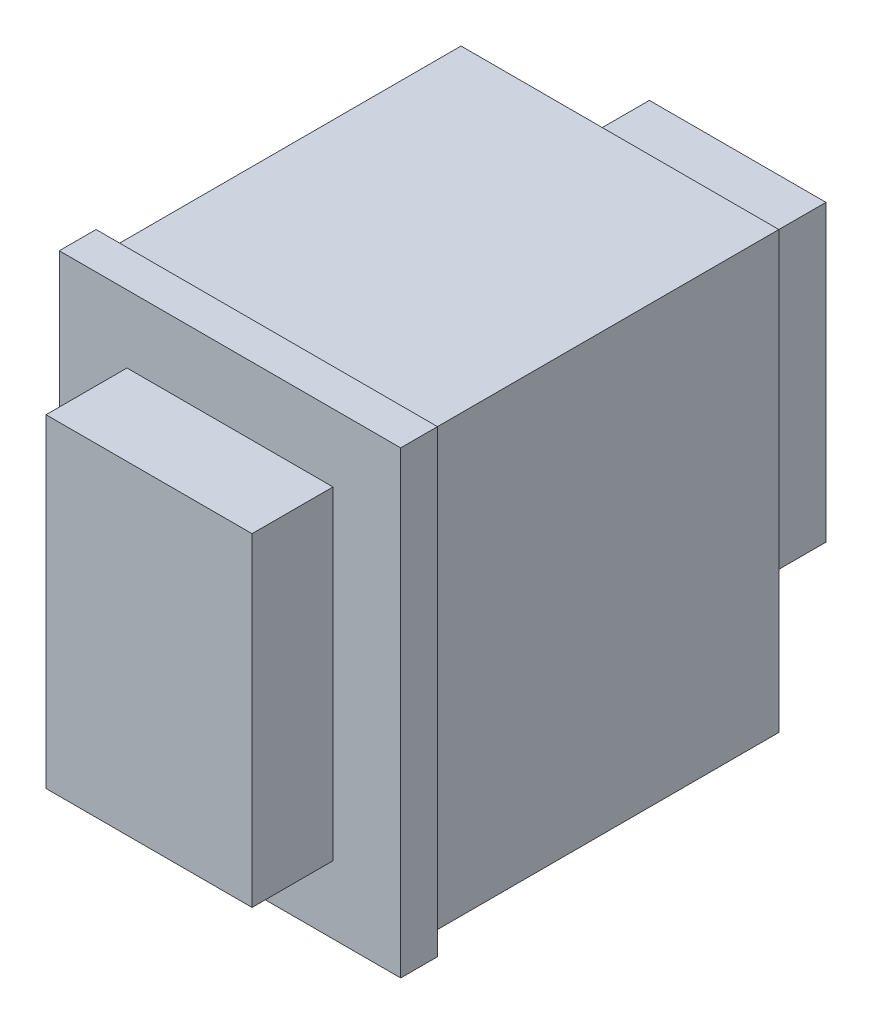
ISO-10303-21;
HEADER;
FILE_DESCRIPTION(('STEP AP214'),'2;1');
FILE_NAME('part.step','',(''),(''),'','','');
FILE_SCHEMA(('AUTOMOTIVE_DESIGN { 1 0 10303 214 1 1 1 1 }'));
ENDSEC;
DATA;
#1=APPLICATION_CONTEXT('core data for automotive mechanical design processes');
#2=APPLICATION_PROTOCOL_DEFINITION('international standard','automotive_design',2000,#1);
#3=PRODUCT_CONTEXT('',#1,'mechanical');
#4=PRODUCT('Part','Part','',(#3));
#5=PRODUCT_RELATED_PRODUCT_CATEGORY('part','',(#4));
#6=PRODUCT_DEFINITION_FORMATION('','',#4);
#7=PRODUCT_DEFINITION_CONTEXT('part definition',#1,'design');
#8=PRODUCT_DEFINITION('design','',#6,#7);
#9=PRODUCT_DEFINITION_SHAPE('','',#8);
#10=(LENGTH_UNIT() NAMED_UNIT(*) SI_UNIT(.MILLI.,.METRE.));
#11=(NAMED_UNIT(*) PLANE_ANGLE_UNIT() SI_UNIT($,.RADIAN.));
#12=(NAMED_UNIT(*) SI_UNIT($,.STERADIAN.) SOLID_ANGLE_UNIT());
#13=UNCERTAINTY_MEASURE_WITH_UNIT(LENGTH_MEASURE(1.E-05),#10,'distance_accuracy_value','');
#14=(GEOMETRIC_REPRESENTATION_CONTEXT(3) GLOBAL_UNCERTAINTY_ASSIGNED_CONTEXT((#13)) GLOBAL_UNIT_ASSIGNED_CONTEXT((#10,
#11,#12)) REPRESENTATION_CONTEXT('',''));
#15=CARTESIAN_POINT('',(0.,0.,0.));
#16=DIRECTION('',(0.,0.,1.));
#17=DIRECTION('',(1.,0.,0.));
#18=AXIS2_PLACEMENT_3D('',#15,#16,#17);
#19=CARTESIAN_POINT('',(-11.6,15.6,2.5));
#20=DIRECTION('',(1.,0.,0.));
#21=DIRECTION('',(0.,0.,-1.));
#22=AXIS2_PLACEMENT_3D('',#19,#20,#21);
#23=PLANE('',#22);
#24=DIRECTION('',(0.,-1.,0.));
#25=VECTOR('',#24,1.);
#26=CARTESIAN_POINT('',(-11.6,15.6,0.));
#27=LINE('',#26,#25);
#28=CARTESIAN_POINT('',(-11.6,15.6,0.));
#29=VERTEX_POINT('',#28);
#30=CARTESIAN_POINT('',(-11.6,-15.6,0.));
#31=VERTEX_POINT('',#30);
#32=EDGE_CURVE('E254',#29,#31,#27,.T.);
#33=ORIENTED_EDGE('',*,*,#32,.T.);
#34=DIRECTION('',(0.,0.,-1.));
#35=VECTOR('',#34,1.);
#36=CARTESIAN_POINT('',(-11.6,-15.6,2.5));
#37=LINE('',#36,#35);
#38=CARTESIAN_POINT('',(-11.6,-15.6,2.5));
#39=VERTEX_POINT('',#38);
#40=EDGE_CURVE('E11',#39,#31,#37,.T.);
#41=ORIENTED_EDGE('',*,*,#40,.F.);
#42=DIRECTION('',(0.,-1.,0.));
#43=VECTOR('',#42,1.);
#44=CARTESIAN_POINT('',(-11.6,15.6,2.5));
#45=LINE('',#44,#43);
#46=CARTESIAN_POINT('',(-11.6,15.6,2.5));
#47=VERTEX_POINT('',#46);
#48=EDGE_CURVE('E258',#47,#39,#45,.T.);
#49=ORIENTED_EDGE('',*,*,#48,.F.);
#50=DIRECTION('',(0.,0.,-1.));
#51=VECTOR('',#50,1.);
#52=CARTESIAN_POINT('',(-11.6,15.6,2.5));
#53=LINE('',#52,#51);
#54=EDGE_CURVE('E266',#47,#29,#53,.T.);
#55=ORIENTED_EDGE('',*,*,#54,.T.);
#56=EDGE_LOOP('',(#33,#41,#49,#55));
#57=FACE_BOUND('',#56,.T.);
#58=ADVANCED_FACE('F39',(#57),#23,.F.);
#59=CARTESIAN_POINT('',(-11.6,-15.6,2.5));
#60=DIRECTION('',(0.,1.,0.));
#61=DIRECTION('',(0.,0.,1.));
#62=AXIS2_PLACEMENT_3D('',#59,#60,#61);
#63=PLANE('',#62);
#64=DIRECTION('',(1.,0.,0.));
#65=VECTOR('',#64,1.);
#66=CARTESIAN_POINT('',(-11.6,-15.6,0.));
#67=LINE('',#66,#65);
#68=CARTESIAN_POINT('',(11.6,-15.6,0.));
#69=VERTEX_POINT('',#68);
#70=EDGE_CURVE('E267',#31,#69,#67,.T.);
#71=ORIENTED_EDGE('',*,*,#70,.T.);
#72=DIRECTION('',(0.,0.,-1.));
#73=VECTOR('',#72,1.);
#74=CARTESIAN_POINT('',(11.6,-15.6,2.5));
#75=LINE('',#74,#73);
#76=CARTESIAN_POINT('',(11.6,-15.6,2.5));
#77=VERTEX_POINT('',#76);
#78=EDGE_CURVE('E46',#77,#69,#75,.T.);
#79=ORIENTED_EDGE('',*,*,#78,.F.);
#80=DIRECTION('',(1.,0.,0.));
#81=VECTOR('',#80,1.);
#82=CARTESIAN_POINT('',(-11.6,-15.6,2.5));
#83=LINE('',#82,#81);
#84=EDGE_CURVE('E259',#39,#77,#83,.T.);
#85=ORIENTED_EDGE('',*,*,#84,.F.);
#86=ORIENTED_EDGE('',*,*,#40,.T.);
#87=EDGE_LOOP('',(#71,#79,#85,#86));
#88=FACE_BOUND('',#87,.T.);
#89=ADVANCED_FACE('F298',(#88),#63,.F.);
#90=CARTESIAN_POINT('',(11.6,-15.6,2.5));
#91=DIRECTION('',(-1.,0.,0.));
#92=DIRECTION('',(0.,0.,1.));
#93=AXIS2_PLACEMENT_3D('',#90,#91,#92);
#94=PLANE('',#93);
#95=DIRECTION('',(0.,1.,0.));
#96=VECTOR('',#95,1.);
#97=CARTESIAN_POINT('',(11.6,-15.6,0.));
#98=LINE('',#97,#96);
#99=CARTESIAN_POINT('',(11.6,15.6,0.));
#100=VERTEX_POINT('',#99);
#101=EDGE_CURVE('E271',#69,#100,#98,.T.);
#102=ORIENTED_EDGE('',*,*,#101,.T.);
#103=DIRECTION('',(0.,0.,-1.));
#104=VECTOR('',#103,1.);
#105=CARTESIAN_POINT('',(11.6,15.6,2.5));
#106=LINE('',#105,#104);
#107=CARTESIAN_POINT('',(11.6,15.6,2.5));
#108=VERTEX_POINT('',#107);
#109=EDGE_CURVE('E277',#108,#100,#106,.T.);
#110=ORIENTED_EDGE('',*,*,#109,.F.);
#111=DIRECTION('',(0.,1.,0.));
#112=VECTOR('',#111,1.);
#113=CARTESIAN_POINT('',(11.6,-15.6,2.5));
#114=LINE('',#113,#112);
#115=EDGE_CURVE('E265',#77,#108,#114,.T.);
#116=ORIENTED_EDGE('',*,*,#115,.F.);
#117=ORIENTED_EDGE('',*,*,#78,.T.);
#118=EDGE_LOOP('',(#102,#110,#116,#117));
#119=FACE_BOUND('',#118,.T.);
#120=ADVANCED_FACE('F285',(#119),#94,.F.);
#121=CARTESIAN_POINT('',(11.6,15.6,2.5));
#122=DIRECTION('',(0.,-1.,0.));
#123=DIRECTION('',(0.,0.,-1.));
#124=AXIS2_PLACEMENT_3D('',#121,#122,#123);
#125=PLANE('',#124);
#126=DIRECTION('',(-1.,0.,0.));
#127=VECTOR('',#126,1.);
#128=CARTESIAN_POINT('',(11.6,15.6,0.));
#129=LINE('',#128,#127);
#130=EDGE_CURVE('E257',#100,#29,#129,.T.);
#131=ORIENTED_EDGE('',*,*,#130,.T.);
#132=ORIENTED_EDGE('',*,*,#54,.F.);
#133=DIRECTION('',(-1.,0.,0.));
#134=VECTOR('',#133,1.);
#135=CARTESIAN_POINT('',(11.6,15.6,2.5));
#136=LINE('',#135,#134);
#137=EDGE_CURVE('E262',#108,#47,#136,.T.);
#138=ORIENTED_EDGE('',*,*,#137,.F.);
#139=ORIENTED_EDGE('',*,*,#109,.T.);
#140=EDGE_LOOP('',(#131,#132,#138,#139));
#141=FACE_BOUND('',#140,.T.);
#142=ADVANCED_FACE('F295',(#141),#125,.F.);
#143=CARTESIAN_POINT('',(0.,0.,2.5));
#144=DIRECTION('',(0.,0.,1.));
#145=DIRECTION('',(1.,0.,0.));
#146=AXIS2_PLACEMENT_3D('',#143,#144,#145);
#147=PLANE('',#146);
#148=DIRECTION('',(0.,-1.,0.));
#149=VECTOR('',#148,1.);
#150=CARTESIAN_POINT('',(-7.,11.,2.5));
#151=LINE('',#150,#149);
#152=CARTESIAN_POINT('',(-7.,11.,2.5));
#153=VERTEX_POINT('',#152);
#154=CARTESIAN_POINT('',(-7.,-11.,2.5));
#155=VERTEX_POINT('',#154);
#156=EDGE_CURVE('E225',#153,#155,#151,.T.);
#157=ORIENTED_EDGE('',*,*,#156,.F.);
#158=DIRECTION('',(-1.,0.,0.));
#159=VECTOR('',#158,1.);
#160=CARTESIAN_POINT('',(7.,11.,2.5));
#161=LINE('',#160,#159);
#162=CARTESIAN_POINT('',(7.,11.,2.5));
#163=VERTEX_POINT('',#162);
#164=EDGE_CURVE('E226',#163,#153,#161,.T.);
#165=ORIENTED_EDGE('',*,*,#164,.F.);
#166=DIRECTION('',(0.,1.,0.));
#167=VECTOR('',#166,1.);
#168=CARTESIAN_POINT('',(7.,-11.,2.5));
#169=LINE('',#168,#167);
#170=CARTESIAN_POINT('',(7.,-11.,2.5));
#171=VERTEX_POINT('',#170);
#172=EDGE_CURVE('E239',#171,#163,#169,.T.);
#173=ORIENTED_EDGE('',*,*,#172,.F.);
#174=DIRECTION('',(1.,0.,0.));
#175=VECTOR('',#174,1.);
#176=CARTESIAN_POINT('',(-7.,-11.,2.5));
#177=LINE('',#176,#175);
#178=EDGE_CURVE('E237',#155,#171,#177,.T.);
#179=ORIENTED_EDGE('',*,*,#178,.F.);
#180=EDGE_LOOP('',(#157,#165,#173,#179));
#181=FACE_BOUND('',#180,.T.);
#182=ORIENTED_EDGE('',*,*,#48,.T.);
#183=ORIENTED_EDGE('',*,*,#84,.T.);
#184=ORIENTED_EDGE('',*,*,#115,.T.);
#185=ORIENTED_EDGE('',*,*,#137,.T.);
#186=EDGE_LOOP('',(#182,#183,#184,#185));
#187=FACE_BOUND('',#186,.T.);
#188=ADVANCED_FACE('F300',(#181,#187),#147,.T.);
#189=CARTESIAN_POINT('',(0.,0.,0.));
#190=DIRECTION('',(0.,0.,1.));
#191=DIRECTION('',(1.,0.,0.));
#192=AXIS2_PLACEMENT_3D('',#189,#190,#191);
#193=PLANE('',#192);
#194=DIRECTION('',(-1.,0.,0.));
#195=VECTOR('',#194,1.);
#196=CARTESIAN_POINT('',(10.8,14.8,0.));
#197=LINE('',#196,#195);
#198=CARTESIAN_POINT('',(10.8,14.8,0.));
#199=VERTEX_POINT('',#198);
#200=CARTESIAN_POINT('',(-10.8,14.8,0.));
#201=VERTEX_POINT('',#200);
#202=EDGE_CURVE('E203',#199,#201,#197,.T.);
#203=ORIENTED_EDGE('',*,*,#202,.T.);
#204=DIRECTION('',(0.,-1.,0.));
#205=VECTOR('',#204,1.);
#206=CARTESIAN_POINT('',(-10.8,14.8,0.));
#207=LINE('',#206,#205);
#208=CARTESIAN_POINT('',(-10.8,-14.8,0.));
#209=VERTEX_POINT('',#208);
#210=EDGE_CURVE('E64',#201,#209,#207,.T.);
#211=ORIENTED_EDGE('',*,*,#210,.T.);
#212=DIRECTION('',(1.,0.,0.));
#213=VECTOR('',#212,1.);
#214=CARTESIAN_POINT('',(-10.8,-14.8,0.));
#215=LINE('',#214,#213);
#216=CARTESIAN_POINT('',(10.8,-14.8,0.));
#217=VERTEX_POINT('',#216);
#218=EDGE_CURVE('E193',#209,#217,#215,.T.);
#219=ORIENTED_EDGE('',*,*,#218,.T.);
#220=DIRECTION('',(0.,1.,0.));
#221=VECTOR('',#220,1.);
#222=CARTESIAN_POINT('',(10.8,-14.8,0.));
#223=LINE('',#222,#221);
#224=EDGE_CURVE('E196',#217,#199,#223,.T.);
#225=ORIENTED_EDGE('',*,*,#224,.T.);
#226=EDGE_LOOP('',(#203,#211,#219,#225));
#227=FACE_BOUND('',#226,.T.);
#228=ORIENTED_EDGE('',*,*,#32,.F.);
#229=ORIENTED_EDGE('',*,*,#130,.F.);
#230=ORIENTED_EDGE('',*,*,#101,.F.);
#231=ORIENTED_EDGE('',*,*,#70,.F.);
#232=EDGE_LOOP('',(#228,#229,#230,#231));
#233=FACE_BOUND('',#232,.T.);
#234=ADVANCED_FACE('F288',(#227,#233),#193,.F.);
#235=CARTESIAN_POINT('',(-7.,11.,8.));
#236=DIRECTION('',(1.,0.,0.));
#237=DIRECTION('',(0.,0.,-1.));
#238=AXIS2_PLACEMENT_3D('',#235,#236,#237);
#239=PLANE('',#238);
#240=ORIENTED_EDGE('',*,*,#156,.T.);
#241=DIRECTION('',(0.,0.,-1.));
#242=VECTOR('',#241,1.);
#243=CARTESIAN_POINT('',(-7.,-11.,8.));
#244=LINE('',#243,#242);
#245=CARTESIAN_POINT('',(-7.,-11.,8.));
#246=VERTEX_POINT('',#245);
#247=EDGE_CURVE('E252',#246,#155,#244,.T.);
#248=ORIENTED_EDGE('',*,*,#247,.F.);
#249=DIRECTION('',(0.,-1.,0.));
#250=VECTOR('',#249,1.);
#251=CARTESIAN_POINT('',(-7.,11.,8.));
#252=LINE('',#251,#250);
#253=CARTESIAN_POINT('',(-7.,11.,8.));
#254=VERTEX_POINT('',#253);
#255=EDGE_CURVE('E224',#254,#246,#252,.T.);
#256=ORIENTED_EDGE('',*,*,#255,.F.);
#257=DIRECTION('',(0.,0.,-1.));
#258=VECTOR('',#257,1.);
#259=CARTESIAN_POINT('',(-7.,11.,8.));
#260=LINE('',#259,#258);
#261=EDGE_CURVE('E234',#254,#153,#260,.T.);
#262=ORIENTED_EDGE('',*,*,#261,.T.);
#263=EDGE_LOOP('',(#240,#248,#256,#262));
#264=FACE_BOUND('',#263,.T.);
#265=ADVANCED_FACE('F313',(#264),#239,.F.);
#266=CARTESIAN_POINT('',(-7.,-11.,8.));
#267=DIRECTION('',(0.,1.,0.));
#268=DIRECTION('',(0.,0.,1.));
#269=AXIS2_PLACEMENT_3D('',#266,#267,#268);
#270=PLANE('',#269);
#271=ORIENTED_EDGE('',*,*,#178,.T.);
#272=DIRECTION('',(0.,0.,-1.));
#273=VECTOR('',#272,1.);
#274=CARTESIAN_POINT('',(7.,-11.,8.));
#275=LINE('',#274,#273);
#276=CARTESIAN_POINT('',(7.,-11.,8.));
#277=VERTEX_POINT('',#276);
#278=EDGE_CURVE('E248',#277,#171,#275,.T.);
#279=ORIENTED_EDGE('',*,*,#278,.F.);
#280=DIRECTION('',(1.,0.,0.));
#281=VECTOR('',#280,1.);
#282=CARTESIAN_POINT('',(-7.,-11.,8.));
#283=LINE('',#282,#281);
#284=EDGE_CURVE('E229',#246,#277,#283,.T.);
#285=ORIENTED_EDGE('',*,*,#284,.F.);
#286=ORIENTED_EDGE('',*,*,#247,.T.);
#287=EDGE_LOOP('',(#271,#279,#285,#286));
#288=FACE_BOUND('',#287,.T.);
#289=ADVANCED_FACE('F318',(#288),#270,.F.);
#290=CARTESIAN_POINT('',(7.,-11.,8.));
#291=DIRECTION('',(-1.,0.,0.));
#292=DIRECTION('',(0.,0.,1.));
#293=AXIS2_PLACEMENT_3D('',#290,#291,#292);
#294=PLANE('',#293);
#295=ORIENTED_EDGE('',*,*,#172,.T.);
#296=DIRECTION('',(0.,0.,-1.));
#297=VECTOR('',#296,1.);
#298=CARTESIAN_POINT('',(7.,11.,8.));
#299=LINE('',#298,#297);
#300=CARTESIAN_POINT('',(7.,11.,8.));
#301=VERTEX_POINT('',#300);
#302=EDGE_CURVE('E246',#301,#163,#299,.T.);
#303=ORIENTED_EDGE('',*,*,#302,.F.);
#304=DIRECTION('',(0.,1.,0.));
#305=VECTOR('',#304,1.);
#306=CARTESIAN_POINT('',(7.,-11.,8.));
#307=LINE('',#306,#305);
#308=EDGE_CURVE('E228',#277,#301,#307,.T.);
#309=ORIENTED_EDGE('',*,*,#308,.F.);
#310=ORIENTED_EDGE('',*,*,#278,.T.);
#311=EDGE_LOOP('',(#295,#303,#309,#310));
#312=FACE_BOUND('',#311,.T.);
#313=ADVANCED_FACE('F325',(#312),#294,.F.);
#314=CARTESIAN_POINT('',(7.,11.,8.));
#315=DIRECTION('',(0.,-1.,0.));
#316=DIRECTION('',(0.,0.,-1.));
#317=AXIS2_PLACEMENT_3D('',#314,#315,#316);
#318=PLANE('',#317);
#319=ORIENTED_EDGE('',*,*,#164,.T.);
#320=ORIENTED_EDGE('',*,*,#261,.F.);
#321=DIRECTION('',(-1.,0.,0.));
#322=VECTOR('',#321,1.);
#323=CARTESIAN_POINT('',(7.,11.,8.));
#324=LINE('',#323,#322);
#325=EDGE_CURVE('E231',#301,#254,#324,.T.);
#326=ORIENTED_EDGE('',*,*,#325,.F.);
#327=ORIENTED_EDGE('',*,*,#302,.T.);
#328=EDGE_LOOP('',(#319,#320,#326,#327));
#329=FACE_BOUND('',#328,.T.);
#330=ADVANCED_FACE('F326',(#329),#318,.F.);
#331=CARTESIAN_POINT('',(0.,0.,8.));
#332=DIRECTION('',(0.,0.,1.));
#333=DIRECTION('',(1.,0.,0.));
#334=AXIS2_PLACEMENT_3D('',#331,#332,#333);
#335=PLANE('',#334);
#336=ORIENTED_EDGE('',*,*,#255,.T.);
#337=ORIENTED_EDGE('',*,*,#284,.T.);
#338=ORIENTED_EDGE('',*,*,#308,.T.);
#339=ORIENTED_EDGE('',*,*,#325,.T.);
#340=EDGE_LOOP('',(#336,#337,#338,#339));
#341=FACE_BOUND('',#340,.T.);
#342=ADVANCED_FACE('F329',(#341),#335,.T.);
#343=CARTESIAN_POINT('',(-10.8,14.8,0.));
#344=DIRECTION('',(1.,0.,0.));
#345=DIRECTION('',(0.,0.,-1.));
#346=AXIS2_PLACEMENT_3D('',#343,#344,#345);
#347=PLANE('',#346);
#348=DIRECTION('',(0.,-1.,0.));
#349=VECTOR('',#348,1.);
#350=CARTESIAN_POINT('',(-10.8,14.8,-24.));
#351=LINE('',#350,#349);
#352=CARTESIAN_POINT('',(-10.8,14.8,-24.));
#353=VERTEX_POINT('',#352);
#354=CARTESIAN_POINT('',(-10.8,-14.8,-24.));
#355=VERTEX_POINT('',#354);
#356=EDGE_CURVE('E166',#353,#355,#351,.T.);
#357=ORIENTED_EDGE('',*,*,#356,.T.);
#358=DIRECTION('',(0.,0.,-1.));
#359=VECTOR('',#358,1.);
#360=CARTESIAN_POINT('',(-10.8,-14.8,0.));
#361=LINE('',#360,#359);
#362=EDGE_CURVE('E218',#209,#355,#361,.T.);
#363=ORIENTED_EDGE('',*,*,#362,.F.);
#364=ORIENTED_EDGE('',*,*,#210,.F.);
#365=DIRECTION('',(0.,0.,-1.));
#366=VECTOR('',#365,1.);
#367=CARTESIAN_POINT('',(-10.8,14.8,0.));
#368=LINE('',#367,#366);
#369=EDGE_CURVE('E204',#201,#353,#368,.T.);
#370=ORIENTED_EDGE('',*,*,#369,.T.);
#371=EDGE_LOOP('',(#357,#363,#364,#370));
#372=FACE_BOUND('',#371,.T.);
#373=ADVANCED_FACE('F331',(#372),#347,.F.);
#374=CARTESIAN_POINT('',(-10.8,-14.8,0.));
#375=DIRECTION('',(0.,1.,0.));
#376=DIRECTION('',(0.,0.,1.));
#377=AXIS2_PLACEMENT_3D('',#374,#375,#376);
#378=PLANE('',#377);
#379=DIRECTION('',(1.,0.,0.));
#380=VECTOR('',#379,1.);
#381=CARTESIAN_POINT('',(-10.8,-14.8,-24.));
#382=LINE('',#381,#380);
#383=CARTESIAN_POINT('',(10.8,-14.8,-24.));
#384=VERTEX_POINT('',#383);
#385=EDGE_CURVE('E210',#355,#384,#382,.T.);
#386=ORIENTED_EDGE('',*,*,#385,.T.);
#387=DIRECTION('',(0.,0.,-1.));
#388=VECTOR('',#387,1.);
#389=CARTESIAN_POINT('',(10.8,-14.8,0.));
#390=LINE('',#389,#388);
#391=EDGE_CURVE('E216',#217,#384,#390,.T.);
#392=ORIENTED_EDGE('',*,*,#391,.F.);
#393=ORIENTED_EDGE('',*,*,#218,.F.);
#394=ORIENTED_EDGE('',*,*,#362,.T.);
#395=EDGE_LOOP('',(#386,#392,#393,#394));
#396=FACE_BOUND('',#395,.T.);
#397=ADVANCED_FACE('F340',(#396),#378,.F.);
#398=CARTESIAN_POINT('',(10.8,-14.8,0.));
#399=DIRECTION('',(-1.,0.,0.));
#400=DIRECTION('',(0.,0.,1.));
#401=AXIS2_PLACEMENT_3D('',#398,#399,#400);
#402=PLANE('',#401);
#403=DIRECTION('',(0.,1.,0.));
#404=VECTOR('',#403,1.);
#405=CARTESIAN_POINT('',(10.8,-14.8,-24.));
#406=LINE('',#405,#404);
#407=CARTESIAN_POINT('',(10.8,14.8,-24.));
#408=VERTEX_POINT('',#407);
#409=EDGE_CURVE('E207',#384,#408,#406,.T.);
#410=ORIENTED_EDGE('',*,*,#409,.T.);
#411=DIRECTION('',(0.,0.,-1.));
#412=VECTOR('',#411,1.);
#413=CARTESIAN_POINT('',(10.8,14.8,0.));
#414=LINE('',#413,#412);
#415=EDGE_CURVE('E213',#199,#408,#414,.T.);
#416=ORIENTED_EDGE('',*,*,#415,.F.);
#417=ORIENTED_EDGE('',*,*,#224,.F.);
#418=ORIENTED_EDGE('',*,*,#391,.T.);
#419=EDGE_LOOP('',(#410,#416,#417,#418));
#420=FACE_BOUND('',#419,.T.);
#421=ADVANCED_FACE('F341',(#420),#402,.F.);
#422=CARTESIAN_POINT('',(10.8,14.8,0.));
#423=DIRECTION('',(0.,-1.,0.));
#424=DIRECTION('',(0.,0.,-1.));
#425=AXIS2_PLACEMENT_3D('',#422,#423,#424);
#426=PLANE('',#425);
#427=DIRECTION('',(-1.,0.,0.));
#428=VECTOR('',#427,1.);
#429=CARTESIAN_POINT('',(10.8,14.8,-24.));
#430=LINE('',#429,#428);
#431=EDGE_CURVE('E195',#408,#353,#430,.T.);
#432=ORIENTED_EDGE('',*,*,#431,.T.);
#433=ORIENTED_EDGE('',*,*,#369,.F.);
#434=ORIENTED_EDGE('',*,*,#202,.F.);
#435=ORIENTED_EDGE('',*,*,#415,.T.);
#436=EDGE_LOOP('',(#432,#433,#434,#435));
#437=FACE_BOUND('',#436,.T.);
#438=ADVANCED_FACE('F345',(#437),#426,.F.);
#439=CARTESIAN_POINT('',(0.,0.,-24.));
#440=DIRECTION('',(0.,0.,1.));
#441=DIRECTION('',(1.,0.,0.));
#442=AXIS2_PLACEMENT_3D('',#439,#440,#441);
#443=PLANE('',#442);
#444=DIRECTION('',(-1.,0.,0.));
#445=VECTOR('',#444,1.);
#446=CARTESIAN_POINT('',(6.,10.,-24.));
#447=LINE('',#446,#445);
#448=CARTESIAN_POINT('',(6.,10.,-24.));
#449=VERTEX_POINT('',#448);
#450=CARTESIAN_POINT('',(-6.,10.,-24.));
#451=VERTEX_POINT('',#450);
#452=EDGE_CURVE('E172',#449,#451,#447,.T.);
#453=ORIENTED_EDGE('',*,*,#452,.T.);
#454=DIRECTION('',(0.,-1.,0.));
#455=VECTOR('',#454,1.);
#456=CARTESIAN_POINT('',(-6.,10.,-24.));
#457=LINE('',#456,#455);
#458=CARTESIAN_POINT('',(-6.,-10.,-24.));
#459=VERTEX_POINT('',#458);
#460=EDGE_CURVE('E52',#451,#459,#457,.T.);
#461=ORIENTED_EDGE('',*,*,#460,.T.);
#462=DIRECTION('',(1.,0.,0.));
#463=VECTOR('',#462,1.);
#464=CARTESIAN_POINT('',(-6.,-10.,-24.));
#465=LINE('',#464,#463);
#466=CARTESIAN_POINT('',(6.,-10.,-24.));
#467=VERTEX_POINT('',#466);
#468=EDGE_CURVE('E154',#459,#467,#465,.T.);
#469=ORIENTED_EDGE('',*,*,#468,.T.);
#470=DIRECTION('',(0.,1.,0.));
#471=VECTOR('',#470,1.);
#472=CARTESIAN_POINT('',(6.,-10.,-24.));
#473=LINE('',#472,#471);
#474=EDGE_CURVE('E163',#467,#449,#473,.T.);
#475=ORIENTED_EDGE('',*,*,#474,.T.);
#476=EDGE_LOOP('',(#453,#461,#469,#475));
#477=FACE_BOUND('',#476,.T.);
#478=ORIENTED_EDGE('',*,*,#356,.F.);
#479=ORIENTED_EDGE('',*,*,#431,.F.);
#480=ORIENTED_EDGE('',*,*,#409,.F.);
#481=ORIENTED_EDGE('',*,*,#385,.F.);
#482=EDGE_LOOP('',(#478,#479,#480,#481));
#483=FACE_BOUND('',#482,.T.);
#484=ADVANCED_FACE('F171',(#477,#483),#443,.F.);
#485=CARTESIAN_POINT('',(-6.,10.,-24.));
#486=DIRECTION('',(1.,0.,0.));
#487=DIRECTION('',(0.,0.,-1.));
#488=AXIS2_PLACEMENT_3D('',#485,#486,#487);
#489=PLANE('',#488);
#490=DIRECTION('',(0.,-1.,0.));
#491=VECTOR('',#490,1.);
#492=CARTESIAN_POINT('',(-6.,10.,-32.));
#493=LINE('',#492,#491);
#494=CARTESIAN_POINT('',(-6.,10.,-32.));
#495=VERTEX_POINT('',#494);
#496=CARTESIAN_POINT('',(-6.,-10.,-32.));
#497=VERTEX_POINT('',#496);
#498=EDGE_CURVE('E169',#495,#497,#493,.T.);
#499=ORIENTED_EDGE('',*,*,#498,.T.);
#500=DIRECTION('',(0.,0.,-1.));
#501=VECTOR('',#500,1.);
#502=CARTESIAN_POINT('',(-6.,-10.,-24.));
#503=LINE('',#502,#501);
#504=EDGE_CURVE('E160',#459,#497,#503,.T.);
#505=ORIENTED_EDGE('',*,*,#504,.F.);
#506=ORIENTED_EDGE('',*,*,#460,.F.);
#507=DIRECTION('',(0.,0.,-1.));
#508=VECTOR('',#507,1.);
#509=CARTESIAN_POINT('',(-6.,10.,-24.));
#510=LINE('',#509,#508);
#511=EDGE_CURVE('E181',#451,#495,#510,.T.);
#512=ORIENTED_EDGE('',*,*,#511,.T.);
#513=EDGE_LOOP('',(#499,#505,#506,#512));
#514=FACE_BOUND('',#513,.T.);
#515=ADVANCED_FACE('F167',(#514),#489,.F.);
#516=CARTESIAN_POINT('',(-6.,-10.,-24.));
#517=DIRECTION('',(0.,1.,0.));
#518=DIRECTION('',(0.,0.,1.));
#519=AXIS2_PLACEMENT_3D('',#516,#517,#518);
#520=PLANE('',#519);
#521=DIRECTION('',(1.,0.,0.));
#522=VECTOR('',#521,1.);
#523=CARTESIAN_POINT('',(-6.,-10.,-32.));
#524=LINE('',#523,#522);
#525=CARTESIAN_POINT('',(6.,-10.,-32.));
#526=VERTEX_POINT('',#525);
#527=EDGE_CURVE('E183',#497,#526,#524,.T.);
#528=ORIENTED_EDGE('',*,*,#527,.T.);
#529=DIRECTION('',(0.,0.,-1.));
#530=VECTOR('',#529,1.);
#531=CARTESIAN_POINT('',(6.,-10.,-24.));
#532=LINE('',#531,#530);
#533=EDGE_CURVE('E159',#467,#526,#532,.T.);
#534=ORIENTED_EDGE('',*,*,#533,.F.);
#535=ORIENTED_EDGE('',*,*,#468,.F.);
#536=ORIENTED_EDGE('',*,*,#504,.T.);
#537=EDGE_LOOP('',(#528,#534,#535,#536));
#538=FACE_BOUND('',#537,.T.);
#539=ADVANCED_FACE('F156',(#538),#520,.F.);
#540=CARTESIAN_POINT('',(6.,-10.,-24.));
#541=DIRECTION('',(-1.,0.,0.));
#542=DIRECTION('',(0.,0.,1.));
#543=AXIS2_PLACEMENT_3D('',#540,#541,#542);
#544=PLANE('',#543);
#545=DIRECTION('',(0.,1.,0.));
#546=VECTOR('',#545,1.);
#547=CARTESIAN_POINT('',(6.,-10.,-32.));
#548=LINE('',#547,#546);
#549=CARTESIAN_POINT('',(6.,10.,-32.));
#550=VERTEX_POINT('',#549);
#551=EDGE_CURVE('E179',#526,#550,#548,.T.);
#552=ORIENTED_EDGE('',*,*,#551,.T.);
#553=DIRECTION('',(0.,0.,-1.));
#554=VECTOR('',#553,1.);
#555=CARTESIAN_POINT('',(6.,10.,-24.));
#556=LINE('',#555,#554);
#557=EDGE_CURVE('E188',#449,#550,#556,.T.);
#558=ORIENTED_EDGE('',*,*,#557,.F.);
#559=ORIENTED_EDGE('',*,*,#474,.F.);
#560=ORIENTED_EDGE('',*,*,#533,.T.);
#561=EDGE_LOOP('',(#552,#558,#559,#560));
#562=FACE_BOUND('',#561,.T.);
#563=ADVANCED_FACE('F356',(#562),#544,.F.);
#564=CARTESIAN_POINT('',(6.,10.,-24.));
#565=DIRECTION('',(0.,-1.,0.));
#566=DIRECTION('',(0.,0.,-1.));
#567=AXIS2_PLACEMENT_3D('',#564,#565,#566);
#568=PLANE('',#567);
#569=DIRECTION('',(-1.,0.,0.));
#570=VECTOR('',#569,1.);
#571=CARTESIAN_POINT('',(6.,10.,-32.));
#572=LINE('',#571,#570);
#573=EDGE_CURVE('E176',#550,#495,#572,.T.);
#574=ORIENTED_EDGE('',*,*,#573,.T.);
#575=ORIENTED_EDGE('',*,*,#511,.F.);
#576=ORIENTED_EDGE('',*,*,#452,.F.);
#577=ORIENTED_EDGE('',*,*,#557,.T.);
#578=EDGE_LOOP('',(#574,#575,#576,#577));
#579=FACE_BOUND('',#578,.T.);
#580=ADVANCED_FACE('F358',(#579),#568,.F.);
#581=CARTESIAN_POINT('',(0.,0.,-32.));
#582=DIRECTION('',(0.,0.,1.));
#583=DIRECTION('',(1.,0.,0.));
#584=AXIS2_PLACEMENT_3D('',#581,#582,#583);
#585=PLANE('',#584);
#586=ORIENTED_EDGE('',*,*,#498,.F.);
#587=ORIENTED_EDGE('',*,*,#573,.F.);
#588=ORIENTED_EDGE('',*,*,#551,.F.);
#589=ORIENTED_EDGE('',*,*,#527,.F.);
#590=EDGE_LOOP('',(#586,#587,#588,#589));
#591=FACE_BOUND('',#590,.T.);
#592=ADVANCED_FACE('F361',(#591),#585,.F.);
#593=CLOSED_SHELL('',(#58,#89,#120,#142,#188,#234,#265,#289,#313,#330,#342,#373,#397,#421,#438,
#484,#515,#539,#563,#580,#592));
#594=MANIFOLD_SOLID_BREP('B2',#593);
#595=ADVANCED_BREP_SHAPE_REPRESENTATION('',(#18,#594),#14);
#596=SHAPE_DEFINITION_REPRESENTATION(#9,#595);
ENDSEC;
END-ISO-10303-21;
